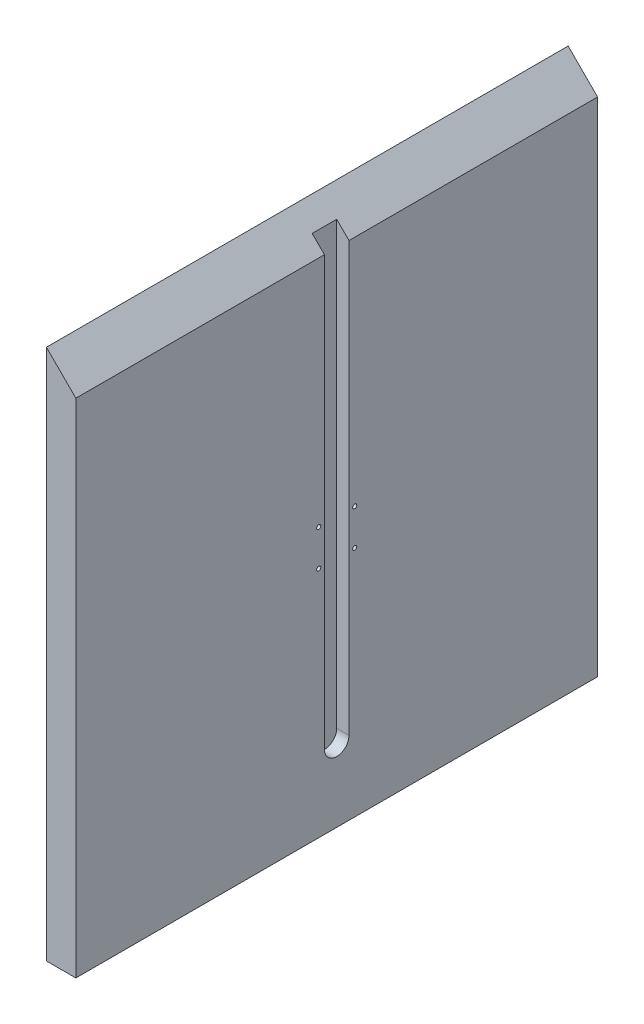
ISO-10303-21;
HEADER;
FILE_DESCRIPTION(('STEP AP214'),'2;1');
FILE_NAME('part.step','',(''),(''),'','','');
FILE_SCHEMA(('AUTOMOTIVE_DESIGN { 1 0 10303 214 1 1 1 1 }'));
ENDSEC;
DATA;
#1=APPLICATION_CONTEXT('core data for automotive mechanical design processes');
#2=APPLICATION_PROTOCOL_DEFINITION('international standard','automotive_design',2000,#1);
#3=PRODUCT_CONTEXT('',#1,'mechanical');
#4=PRODUCT('Part','Part','',(#3));
#5=PRODUCT_RELATED_PRODUCT_CATEGORY('part','',(#4));
#6=PRODUCT_DEFINITION_FORMATION('','',#4);
#7=PRODUCT_DEFINITION_CONTEXT('part definition',#1,'design');
#8=PRODUCT_DEFINITION('design','',#6,#7);
#9=PRODUCT_DEFINITION_SHAPE('','',#8);
#10=(LENGTH_UNIT() NAMED_UNIT(*) SI_UNIT(.MILLI.,.METRE.));
#11=(NAMED_UNIT(*) PLANE_ANGLE_UNIT() SI_UNIT($,.RADIAN.));
#12=(NAMED_UNIT(*) SI_UNIT($,.STERADIAN.) SOLID_ANGLE_UNIT());
#13=UNCERTAINTY_MEASURE_WITH_UNIT(LENGTH_MEASURE(1.E-05),#10,'distance_accuracy_value','');
#14=(GEOMETRIC_REPRESENTATION_CONTEXT(3) GLOBAL_UNCERTAINTY_ASSIGNED_CONTEXT((#13)) GLOBAL_UNIT_ASSIGNED_CONTEXT((#10,
#11,#12)) REPRESENTATION_CONTEXT('',''));
#15=CARTESIAN_POINT('',(0.,0.,0.));
#16=DIRECTION('',(0.,0.,1.));
#17=DIRECTION('',(1.,0.,0.));
#18=AXIS2_PLACEMENT_3D('',#15,#16,#17);
#19=CARTESIAN_POINT('',(-189.,-36.,-638.));
#20=DIRECTION('',(1.,0.,0.));
#21=DIRECTION('',(0.,1.,0.));
#22=AXIS2_PLACEMENT_3D('',#19,#20,#21);
#23=PLANE('',#22);
#24=CARTESIAN_POINT('',(-189.,-365.000000000003,-296.999999999998));
#25=DIRECTION('',(1.,0.,0.));
#26=DIRECTION('',(0.,1.,0.));
#27=AXIS2_PLACEMENT_3D('',#24,#25,#26);
#28=CIRCLE('',#27,2.5);
#29=CARTESIAN_POINT('',(-189.,-362.500000000003,-296.999999999998));
#30=VERTEX_POINT('',#29);
#31=EDGE_CURVE('E206',#30,#30,#28,.T.);
#32=ORIENTED_EDGE('',*,*,#31,.F.);
#33=EDGE_LOOP('',(#32));
#34=FACE_BOUND('',#33,.T.);
#35=CARTESIAN_POINT('',(-189.,-365.000000000003,-340.999999999998));
#36=DIRECTION('',(1.,0.,0.));
#37=DIRECTION('',(0.,1.,0.));
#38=AXIS2_PLACEMENT_3D('',#35,#36,#37);
#39=CIRCLE('',#38,2.5);
#40=CARTESIAN_POINT('',(-189.,-362.500000000003,-340.999999999998));
#41=VERTEX_POINT('',#40);
#42=EDGE_CURVE('E210',#41,#41,#39,.T.);
#43=ORIENTED_EDGE('',*,*,#42,.F.);
#44=EDGE_LOOP('',(#43));
#45=FACE_BOUND('',#44,.T.);
#46=CARTESIAN_POINT('',(-189.,-321.000000000003,-340.999999999998));
#47=DIRECTION('',(1.,0.,0.));
#48=DIRECTION('',(0.,1.,0.));
#49=AXIS2_PLACEMENT_3D('',#46,#47,#48);
#50=CIRCLE('',#49,2.5);
#51=CARTESIAN_POINT('',(-189.,-318.500000000003,-340.999999999998));
#52=VERTEX_POINT('',#51);
#53=EDGE_CURVE('E214',#52,#52,#50,.T.);
#54=ORIENTED_EDGE('',*,*,#53,.F.);
#55=EDGE_LOOP('',(#54));
#56=FACE_BOUND('',#55,.T.);
#57=CARTESIAN_POINT('',(-189.,-321.000000000003,-296.999999999998));
#58=DIRECTION('',(1.,0.,0.));
#59=DIRECTION('',(0.,1.,0.));
#60=AXIS2_PLACEMENT_3D('',#57,#58,#59);
#61=CIRCLE('',#60,2.5);
#62=CARTESIAN_POINT('',(-189.,-318.500000000003,-296.999999999998));
#63=VERTEX_POINT('',#62);
#64=EDGE_CURVE('E138',#63,#63,#61,.T.);
#65=ORIENTED_EDGE('',*,*,#64,.F.);
#66=EDGE_LOOP('',(#65));
#67=FACE_BOUND('',#66,.T.);
#68=DIRECTION('',(0.,1.,0.));
#69=VECTOR('',#68,1.);
#70=CARTESIAN_POINT('',(-189.,-1.85435874539055,-334.));
#71=LINE('',#70,#69);
#72=CARTESIAN_POINT('',(-189.,-560.,-334.));
#73=VERTEX_POINT('',#72);
#74=CARTESIAN_POINT('',(-189.,-36.,-334.));
#75=VERTEX_POINT('',#74);
#76=EDGE_CURVE('E119',#73,#75,#71,.T.);
#77=ORIENTED_EDGE('',*,*,#76,.F.);
#78=CARTESIAN_POINT('',(-189.,-560.,-319.));
#79=DIRECTION('',(1.,0.,0.));
#80=DIRECTION('',(0.,1.,0.));
#81=AXIS2_PLACEMENT_3D('',#78,#79,#80);
#82=CIRCLE('',#81,15.);
#83=CARTESIAN_POINT('',(-189.,-560.,-304.));
#84=VERTEX_POINT('',#83);
#85=EDGE_CURVE('E137',#84,#73,#82,.T.);
#86=ORIENTED_EDGE('',*,*,#85,.F.);
#87=DIRECTION('',(0.,-1.,0.));
#88=VECTOR('',#87,1.);
#89=CARTESIAN_POINT('',(-189.,-1.85435874539056,-304.));
#90=LINE('',#89,#88);
#91=CARTESIAN_POINT('',(-189.,-36.,-304.));
#92=VERTEX_POINT('',#91);
#93=EDGE_CURVE('E125',#92,#84,#90,.T.);
#94=ORIENTED_EDGE('',*,*,#93,.F.);
#95=DIRECTION('',(0.,0.,1.));
#96=VECTOR('',#95,1.);
#97=CARTESIAN_POINT('',(-189.,-36.,-638.));
#98=LINE('',#97,#96);
#99=CARTESIAN_POINT('',(-189.,-36.,0.));
#100=VERTEX_POINT('',#99);
#101=EDGE_CURVE('E153',#92,#100,#98,.T.);
#102=ORIENTED_EDGE('',*,*,#101,.T.);
#103=DIRECTION('',(0.,1.,0.));
#104=VECTOR('',#103,1.);
#105=CARTESIAN_POINT('',(-189.,-36.,0.));
#106=LINE('',#105,#104);
#107=CARTESIAN_POINT('',(-189.,-650.,0.));
#108=VERTEX_POINT('',#107);
#109=EDGE_CURVE('E141',#108,#100,#106,.T.);
#110=ORIENTED_EDGE('',*,*,#109,.F.);
#111=DIRECTION('',(0.,0.,1.));
#112=VECTOR('',#111,1.);
#113=CARTESIAN_POINT('',(-189.,-650.,-638.));
#114=LINE('',#113,#112);
#115=CARTESIAN_POINT('',(-189.,-650.,-638.));
#116=VERTEX_POINT('',#115);
#117=EDGE_CURVE('E60',#116,#108,#114,.T.);
#118=ORIENTED_EDGE('',*,*,#117,.F.);
#119=DIRECTION('',(0.,1.,0.));
#120=VECTOR('',#119,1.);
#121=CARTESIAN_POINT('',(-189.,-36.,-638.));
#122=LINE('',#121,#120);
#123=CARTESIAN_POINT('',(-189.,-36.,-638.));
#124=VERTEX_POINT('',#123);
#125=EDGE_CURVE('E143',#116,#124,#122,.T.);
#126=ORIENTED_EDGE('',*,*,#125,.T.);
#127=EDGE_CURVE('E87',#124,#75,#98,.T.);
#128=ORIENTED_EDGE('',*,*,#127,.T.);
#129=EDGE_LOOP('',(#77,#86,#94,#102,#110,#118,#126,#128));
#130=FACE_BOUND('',#129,.T.);
#131=ADVANCED_FACE('F38',(#34,#45,#56,#67,#130),#23,.T.);
#132=CARTESIAN_POINT('',(-225.,-650.,-638.));
#133=DIRECTION('',(0.,-1.,0.));
#134=DIRECTION('',(0.,0.,-1.));
#135=AXIS2_PLACEMENT_3D('',#132,#133,#134);
#136=PLANE('',#135);
#137=DIRECTION('',(1.,0.,0.));
#138=VECTOR('',#137,1.);
#139=CARTESIAN_POINT('',(-225.,-650.,0.));
#140=LINE('',#139,#138);
#141=CARTESIAN_POINT('',(-225.,-650.,0.));
#142=VERTEX_POINT('',#141);
#143=EDGE_CURVE('E146',#142,#108,#140,.T.);
#144=ORIENTED_EDGE('',*,*,#143,.F.);
#145=DIRECTION('',(0.,0.,1.));
#146=VECTOR('',#145,1.);
#147=CARTESIAN_POINT('',(-225.,-650.,-638.));
#148=LINE('',#147,#146);
#149=CARTESIAN_POINT('',(-225.,-650.,-638.));
#150=VERTEX_POINT('',#149);
#151=EDGE_CURVE('E165',#150,#142,#148,.T.);
#152=ORIENTED_EDGE('',*,*,#151,.F.);
#153=DIRECTION('',(1.,0.,0.));
#154=VECTOR('',#153,1.);
#155=CARTESIAN_POINT('',(-225.,-650.,-638.));
#156=LINE('',#155,#154);
#157=EDGE_CURVE('E151',#150,#116,#156,.T.);
#158=ORIENTED_EDGE('',*,*,#157,.T.);
#159=ORIENTED_EDGE('',*,*,#117,.T.);
#160=EDGE_LOOP('',(#144,#152,#158,#159));
#161=FACE_BOUND('',#160,.T.);
#162=ADVANCED_FACE('F177',(#161),#136,.T.);
#163=CARTESIAN_POINT('',(-225.,0.,-638.));
#164=DIRECTION('',(-1.,0.,0.));
#165=DIRECTION('',(0.,-1.,0.));
#166=AXIS2_PLACEMENT_3D('',#163,#164,#165);
#167=PLANE('',#166);
#168=CARTESIAN_POINT('',(-225.,-365.000000000003,-296.999999999998));
#169=DIRECTION('',(-1.,0.,0.));
#170=DIRECTION('',(0.,0.,1.));
#171=AXIS2_PLACEMENT_3D('',#168,#169,#170);
#172=CIRCLE('',#171,2.5);
#173=CARTESIAN_POINT('',(-225.,-365.000000000003,-294.499999999998));
#174=VERTEX_POINT('',#173);
#175=EDGE_CURVE('E231',#174,#174,#172,.T.);
#176=ORIENTED_EDGE('',*,*,#175,.F.);
#177=EDGE_LOOP('',(#176));
#178=FACE_BOUND('',#177,.T.);
#179=CARTESIAN_POINT('',(-225.,-365.000000000003,-340.999999999998));
#180=DIRECTION('',(-1.,0.,0.));
#181=DIRECTION('',(0.,0.,1.));
#182=AXIS2_PLACEMENT_3D('',#179,#180,#181);
#183=CIRCLE('',#182,2.5);
#184=CARTESIAN_POINT('',(-225.,-365.000000000003,-338.499999999998));
#185=VERTEX_POINT('',#184);
#186=EDGE_CURVE('E227',#185,#185,#183,.T.);
#187=ORIENTED_EDGE('',*,*,#186,.F.);
#188=EDGE_LOOP('',(#187));
#189=FACE_BOUND('',#188,.T.);
#190=CARTESIAN_POINT('',(-225.,-321.000000000003,-340.999999999998));
#191=DIRECTION('',(-1.,0.,0.));
#192=DIRECTION('',(0.,0.,1.));
#193=AXIS2_PLACEMENT_3D('',#190,#191,#192);
#194=CIRCLE('',#193,2.5);
#195=CARTESIAN_POINT('',(-225.,-321.000000000003,-338.499999999998));
#196=VERTEX_POINT('',#195);
#197=EDGE_CURVE('E223',#196,#196,#194,.T.);
#198=ORIENTED_EDGE('',*,*,#197,.F.);
#199=EDGE_LOOP('',(#198));
#200=FACE_BOUND('',#199,.T.);
#201=CARTESIAN_POINT('',(-225.,-321.000000000003,-296.999999999998));
#202=DIRECTION('',(-1.,0.,0.));
#203=DIRECTION('',(0.,0.,1.));
#204=AXIS2_PLACEMENT_3D('',#201,#202,#203);
#205=CIRCLE('',#204,2.5);
#206=CARTESIAN_POINT('',(-225.,-321.000000000003,-294.499999999998));
#207=VERTEX_POINT('',#206);
#208=EDGE_CURVE('E218',#207,#207,#205,.T.);
#209=ORIENTED_EDGE('',*,*,#208,.F.);
#210=EDGE_LOOP('',(#209));
#211=FACE_BOUND('',#210,.T.);
#212=DIRECTION('',(0.,-1.,0.));
#213=VECTOR('',#212,1.);
#214=CARTESIAN_POINT('',(-225.,0.,0.));
#215=LINE('',#214,#213);
#216=CARTESIAN_POINT('',(-225.,0.,0.));
#217=VERTEX_POINT('',#216);
#218=EDGE_CURVE('E159',#217,#142,#215,.T.);
#219=ORIENTED_EDGE('',*,*,#218,.F.);
#220=DIRECTION('',(0.,0.,1.));
#221=VECTOR('',#220,1.);
#222=CARTESIAN_POINT('',(-225.,0.,-638.));
#223=LINE('',#222,#221);
#224=CARTESIAN_POINT('',(-225.,0.,-638.));
#225=VERTEX_POINT('',#224);
#226=EDGE_CURVE('E167',#225,#217,#223,.T.);
#227=ORIENTED_EDGE('',*,*,#226,.F.);
#228=DIRECTION('',(0.,-1.,0.));
#229=VECTOR('',#228,1.);
#230=CARTESIAN_POINT('',(-225.,0.,-638.));
#231=LINE('',#230,#229);
#232=EDGE_CURVE('E148',#225,#150,#231,.T.);
#233=ORIENTED_EDGE('',*,*,#232,.T.);
#234=ORIENTED_EDGE('',*,*,#151,.T.);
#235=EDGE_LOOP('',(#219,#227,#233,#234));
#236=FACE_BOUND('',#235,.T.);
#237=ADVANCED_FACE('F181',(#178,#189,#200,#211,#236),#167,.T.);
#238=CARTESIAN_POINT('',(-189.,-36.,-638.));
#239=DIRECTION('',(0.707106781186551,0.707106781186544,0.));
#240=DIRECTION('',(-0.707106781186544,0.707106781186551,0.));
#241=AXIS2_PLACEMENT_3D('',#238,#239,#240);
#242=PLANE('',#241);
#243=DIRECTION('',(-0.707106781186544,0.707106781186551,0.));
#244=VECTOR('',#243,1.);
#245=CARTESIAN_POINT('',(-189.,-36.,-334.));
#246=LINE('',#245,#244);
#247=CARTESIAN_POINT('',(-204.,-21.,-334.));
#248=VERTEX_POINT('',#247);
#249=EDGE_CURVE('E11',#75,#248,#246,.T.);
#250=ORIENTED_EDGE('',*,*,#249,.F.);
#251=ORIENTED_EDGE('',*,*,#127,.F.);
#252=DIRECTION('',(-0.707106781186544,0.707106781186551,0.));
#253=VECTOR('',#252,1.);
#254=CARTESIAN_POINT('',(-189.,-36.,-638.));
#255=LINE('',#254,#253);
#256=EDGE_CURVE('E145',#124,#225,#255,.T.);
#257=ORIENTED_EDGE('',*,*,#256,.T.);
#258=ORIENTED_EDGE('',*,*,#226,.T.);
#259=DIRECTION('',(-0.707106781186544,0.707106781186551,0.));
#260=VECTOR('',#259,1.);
#261=CARTESIAN_POINT('',(-189.,-36.,0.));
#262=LINE('',#261,#260);
#263=EDGE_CURVE('E156',#100,#217,#262,.T.);
#264=ORIENTED_EDGE('',*,*,#263,.F.);
#265=ORIENTED_EDGE('',*,*,#101,.F.);
#266=DIRECTION('',(0.707106781186544,-0.707106781186551,0.));
#267=VECTOR('',#266,1.);
#268=CARTESIAN_POINT('',(-189.,-36.,-304.));
#269=LINE('',#268,#267);
#270=CARTESIAN_POINT('',(-204.,-21.,-304.));
#271=VERTEX_POINT('',#270);
#272=EDGE_CURVE('E45',#271,#92,#269,.T.);
#273=ORIENTED_EDGE('',*,*,#272,.F.);
#274=DIRECTION('',(0.,0.,1.));
#275=VECTOR('',#274,1.);
#276=CARTESIAN_POINT('',(-204.,-21.,-638.));
#277=LINE('',#276,#275);
#278=EDGE_CURVE('E116',#248,#271,#277,.T.);
#279=ORIENTED_EDGE('',*,*,#278,.F.);
#280=EDGE_LOOP('',(#250,#251,#257,#258,#264,#265,#273,#279));
#281=FACE_BOUND('',#280,.T.);
#282=ADVANCED_FACE('F173',(#281),#242,.T.);
#283=CARTESIAN_POINT('',(0.,0.,-638.));
#284=DIRECTION('',(0.,0.,1.));
#285=DIRECTION('',(1.,0.,0.));
#286=AXIS2_PLACEMENT_3D('',#283,#284,#285);
#287=PLANE('',#286);
#288=ORIENTED_EDGE('',*,*,#125,.F.);
#289=ORIENTED_EDGE('',*,*,#157,.F.);
#290=ORIENTED_EDGE('',*,*,#232,.F.);
#291=ORIENTED_EDGE('',*,*,#256,.F.);
#292=EDGE_LOOP('',(#288,#289,#290,#291));
#293=FACE_BOUND('',#292,.T.);
#294=ADVANCED_FACE('F183',(#293),#287,.F.);
#295=CARTESIAN_POINT('',(0.,0.,0.));
#296=DIRECTION('',(0.,0.,1.));
#297=DIRECTION('',(1.,0.,0.));
#298=AXIS2_PLACEMENT_3D('',#295,#296,#297);
#299=PLANE('',#298);
#300=ORIENTED_EDGE('',*,*,#109,.T.);
#301=ORIENTED_EDGE('',*,*,#263,.T.);
#302=ORIENTED_EDGE('',*,*,#218,.T.);
#303=ORIENTED_EDGE('',*,*,#143,.T.);
#304=EDGE_LOOP('',(#300,#301,#302,#303));
#305=FACE_BOUND('',#304,.T.);
#306=ADVANCED_FACE('F176',(#305),#299,.T.);
#307=CARTESIAN_POINT('',(-204.,-1.85435874539056,-334.));
#308=DIRECTION('',(0.,0.,-1.));
#309=DIRECTION('',(0.,1.,0.));
#310=AXIS2_PLACEMENT_3D('',#307,#308,#309);
#311=PLANE('',#310);
#312=ORIENTED_EDGE('',*,*,#249,.T.);
#313=DIRECTION('',(0.,1.,0.));
#314=VECTOR('',#313,1.);
#315=CARTESIAN_POINT('',(-204.,-1.85435874539056,-334.));
#316=LINE('',#315,#314);
#317=CARTESIAN_POINT('',(-204.,-560.,-334.));
#318=VERTEX_POINT('',#317);
#319=EDGE_CURVE('E52',#318,#248,#316,.T.);
#320=ORIENTED_EDGE('',*,*,#319,.F.);
#321=DIRECTION('',(1.,0.,0.));
#322=VECTOR('',#321,1.);
#323=CARTESIAN_POINT('',(-204.,-560.,-334.));
#324=LINE('',#323,#322);
#325=EDGE_CURVE('E129',#318,#73,#324,.T.);
#326=ORIENTED_EDGE('',*,*,#325,.T.);
#327=ORIENTED_EDGE('',*,*,#76,.T.);
#328=EDGE_LOOP('',(#312,#320,#326,#327));
#329=FACE_BOUND('',#328,.T.);
#330=ADVANCED_FACE('F185',(#329),#311,.F.);
#331=CARTESIAN_POINT('',(-204.,-560.,-319.));
#332=DIRECTION('',(1.,0.,0.));
#333=DIRECTION('',(0.,1.,0.));
#334=AXIS2_PLACEMENT_3D('',#331,#332,#333);
#335=CYLINDRICAL_SURFACE('',#334,15.);
#336=ORIENTED_EDGE('',*,*,#85,.T.);
#337=ORIENTED_EDGE('',*,*,#325,.F.);
#338=CARTESIAN_POINT('',(-204.,-560.,-319.));
#339=DIRECTION('',(1.,0.,0.));
#340=DIRECTION('',(0.,1.,0.));
#341=AXIS2_PLACEMENT_3D('',#338,#339,#340);
#342=CIRCLE('',#341,15.);
#343=CARTESIAN_POINT('',(-204.,-560.,-304.));
#344=VERTEX_POINT('',#343);
#345=EDGE_CURVE('E114',#344,#318,#342,.T.);
#346=ORIENTED_EDGE('',*,*,#345,.F.);
#347=DIRECTION('',(1.,0.,0.));
#348=VECTOR('',#347,1.);
#349=CARTESIAN_POINT('',(-204.,-560.,-304.));
#350=LINE('',#349,#348);
#351=EDGE_CURVE('E122',#344,#84,#350,.T.);
#352=ORIENTED_EDGE('',*,*,#351,.T.);
#353=EDGE_LOOP('',(#336,#337,#346,#352));
#354=FACE_BOUND('',#353,.T.);
#355=ADVANCED_FACE('F131',(#354),#335,.F.);
#356=CARTESIAN_POINT('',(-204.,-1.85435874539056,-304.));
#357=DIRECTION('',(0.,0.,1.));
#358=DIRECTION('',(0.,-1.,0.));
#359=AXIS2_PLACEMENT_3D('',#356,#357,#358);
#360=PLANE('',#359);
#361=ORIENTED_EDGE('',*,*,#272,.T.);
#362=ORIENTED_EDGE('',*,*,#93,.T.);
#363=ORIENTED_EDGE('',*,*,#351,.F.);
#364=DIRECTION('',(0.,-1.,0.));
#365=VECTOR('',#364,1.);
#366=CARTESIAN_POINT('',(-204.,-1.85435874539056,-304.));
#367=LINE('',#366,#365);
#368=EDGE_CURVE('E110',#271,#344,#367,.T.);
#369=ORIENTED_EDGE('',*,*,#368,.F.);
#370=EDGE_LOOP('',(#361,#362,#363,#369));
#371=FACE_BOUND('',#370,.T.);
#372=ADVANCED_FACE('F123',(#371),#360,.F.);
#373=CARTESIAN_POINT('',(-204.,-1.85435874539056,-319.));
#374=DIRECTION('',(-1.,0.,0.));
#375=DIRECTION('',(0.,-1.,0.));
#376=AXIS2_PLACEMENT_3D('',#373,#374,#375);
#377=PLANE('',#376);
#378=ORIENTED_EDGE('',*,*,#278,.T.);
#379=ORIENTED_EDGE('',*,*,#368,.T.);
#380=ORIENTED_EDGE('',*,*,#345,.T.);
#381=ORIENTED_EDGE('',*,*,#319,.T.);
#382=EDGE_LOOP('',(#378,#379,#380,#381));
#383=FACE_BOUND('',#382,.T.);
#384=ADVANCED_FACE('F112',(#383),#377,.F.);
#385=CARTESIAN_POINT('',(-225.,-321.000000000003,-296.999999999998));
#386=DIRECTION('',(-1.,0.,0.));
#387=DIRECTION('',(0.,0.,1.));
#388=AXIS2_PLACEMENT_3D('',#385,#386,#387);
#389=CYLINDRICAL_SURFACE('',#388,2.5);
#390=ORIENTED_EDGE('',*,*,#208,.T.);
#391=EDGE_LOOP('',(#390));
#392=FACE_BOUND('',#391,.T.);
#393=ORIENTED_EDGE('',*,*,#64,.T.);
#394=EDGE_LOOP('',(#393));
#395=FACE_BOUND('',#394,.T.);
#396=ADVANCED_FACE('F246',(#392,#395),#389,.F.);
#397=CARTESIAN_POINT('',(-225.,-321.000000000003,-340.999999999998));
#398=DIRECTION('',(-1.,0.,0.));
#399=DIRECTION('',(0.,0.,1.));
#400=AXIS2_PLACEMENT_3D('',#397,#398,#399);
#401=CYLINDRICAL_SURFACE('',#400,2.5);
#402=ORIENTED_EDGE('',*,*,#197,.T.);
#403=EDGE_LOOP('',(#402));
#404=FACE_BOUND('',#403,.T.);
#405=ORIENTED_EDGE('',*,*,#53,.T.);
#406=EDGE_LOOP('',(#405));
#407=FACE_BOUND('',#406,.T.);
#408=ADVANCED_FACE('F248',(#404,#407),#401,.F.);
#409=CARTESIAN_POINT('',(-225.,-365.000000000003,-340.999999999998));
#410=DIRECTION('',(-1.,0.,0.));
#411=DIRECTION('',(0.,0.,1.));
#412=AXIS2_PLACEMENT_3D('',#409,#410,#411);
#413=CYLINDRICAL_SURFACE('',#412,2.5);
#414=ORIENTED_EDGE('',*,*,#186,.T.);
#415=EDGE_LOOP('',(#414));
#416=FACE_BOUND('',#415,.T.);
#417=ORIENTED_EDGE('',*,*,#42,.T.);
#418=EDGE_LOOP('',(#417));
#419=FACE_BOUND('',#418,.T.);
#420=ADVANCED_FACE('F254',(#416,#419),#413,.F.);
#421=CARTESIAN_POINT('',(-225.,-365.000000000003,-296.999999999998));
#422=DIRECTION('',(-1.,0.,0.));
#423=DIRECTION('',(0.,0.,1.));
#424=AXIS2_PLACEMENT_3D('',#421,#422,#423);
#425=CYLINDRICAL_SURFACE('',#424,2.5);
#426=ORIENTED_EDGE('',*,*,#175,.T.);
#427=EDGE_LOOP('',(#426));
#428=FACE_BOUND('',#427,.T.);
#429=ORIENTED_EDGE('',*,*,#31,.T.);
#430=EDGE_LOOP('',(#429));
#431=FACE_BOUND('',#430,.T.);
#432=ADVANCED_FACE('F235',(#428,#431),#425,.F.);
#433=CLOSED_SHELL('',(#131,#162,#237,#282,#294,#306,#330,#355,#372,#384,#396,#408,#420,#432));
#434=MANIFOLD_SOLID_BREP('B2',#433);
#435=ADVANCED_BREP_SHAPE_REPRESENTATION('',(#18,#434),#14);
#436=SHAPE_DEFINITION_REPRESENTATION(#9,#435);
ENDSEC;
END-ISO-10303-21;
